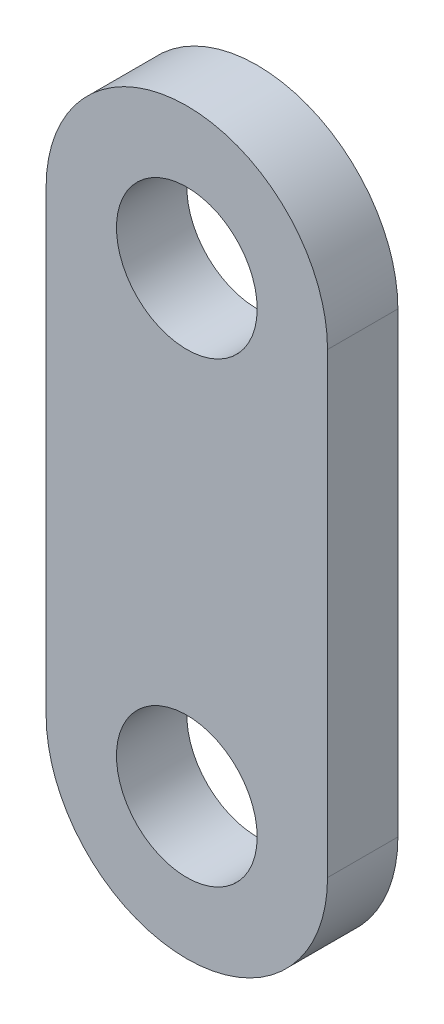
ISO-10303-21;
HEADER;
FILE_DESCRIPTION(('STEP AP214'),'2;1');
FILE_NAME('part.step','',(''),(''),'','','');
FILE_SCHEMA(('AUTOMOTIVE_DESIGN { 1 0 10303 214 1 1 1 1 }'));
ENDSEC;
DATA;
#1=APPLICATION_CONTEXT('core data for automotive mechanical design processes');
#2=APPLICATION_PROTOCOL_DEFINITION('international standard','automotive_design',2000,#1);
#3=PRODUCT_CONTEXT('',#1,'mechanical');
#4=PRODUCT('Part','Part','',(#3));
#5=PRODUCT_RELATED_PRODUCT_CATEGORY('part','',(#4));
#6=PRODUCT_DEFINITION_FORMATION('','',#4);
#7=PRODUCT_DEFINITION_CONTEXT('part definition',#1,'design');
#8=PRODUCT_DEFINITION('design','',#6,#7);
#9=PRODUCT_DEFINITION_SHAPE('','',#8);
#10=(LENGTH_UNIT() NAMED_UNIT(*) SI_UNIT(.MILLI.,.METRE.));
#11=(NAMED_UNIT(*) PLANE_ANGLE_UNIT() SI_UNIT($,.RADIAN.));
#12=(NAMED_UNIT(*) SI_UNIT($,.STERADIAN.) SOLID_ANGLE_UNIT());
#13=UNCERTAINTY_MEASURE_WITH_UNIT(LENGTH_MEASURE(1.E-05),#10,'distance_accuracy_value','');
#14=(GEOMETRIC_REPRESENTATION_CONTEXT(3) GLOBAL_UNCERTAINTY_ASSIGNED_CONTEXT((#13)) GLOBAL_UNIT_ASSIGNED_CONTEXT((#10,
#11,#12)) REPRESENTATION_CONTEXT('',''));
#15=CARTESIAN_POINT('',(0.,0.,0.));
#16=DIRECTION('',(0.,0.,1.));
#17=DIRECTION('',(1.,0.,0.));
#18=AXIS2_PLACEMENT_3D('',#15,#16,#17);
#19=CARTESIAN_POINT('',(0.,10.31875,3.175));
#20=DIRECTION('',(0.,0.,-1.));
#21=DIRECTION('',(-1.,0.,0.));
#22=AXIS2_PLACEMENT_3D('',#19,#20,#21);
#23=CYLINDRICAL_SURFACE('',#22,6.35);
#24=CARTESIAN_POINT('',(0.,10.31875,0.));
#25=DIRECTION('',(0.,0.,1.));
#26=DIRECTION('',(1.,0.,0.));
#27=AXIS2_PLACEMENT_3D('',#24,#25,#26);
#28=CIRCLE('',#27,6.35);
#29=CARTESIAN_POINT('',(6.34999999999999,10.31875,0.));
#30=VERTEX_POINT('',#29);
#31=CARTESIAN_POINT('',(-6.35,10.31875,0.));
#32=VERTEX_POINT('',#31);
#33=EDGE_CURVE('E97',#30,#32,#28,.T.);
#34=ORIENTED_EDGE('',*,*,#33,.T.);
#35=DIRECTION('',(0.,0.,-1.));
#36=VECTOR('',#35,1.);
#37=CARTESIAN_POINT('',(-6.35,10.31875,3.175));
#38=LINE('',#37,#36);
#39=CARTESIAN_POINT('',(-6.35,10.31875,3.175));
#40=VERTEX_POINT('',#39);
#41=EDGE_CURVE('E11',#40,#32,#38,.T.);
#42=ORIENTED_EDGE('',*,*,#41,.F.);
#43=CARTESIAN_POINT('',(0.,10.31875,3.175));
#44=DIRECTION('',(0.,0.,1.));
#45=DIRECTION('',(1.,0.,0.));
#46=AXIS2_PLACEMENT_3D('',#43,#44,#45);
#47=CIRCLE('',#46,6.35);
#48=CARTESIAN_POINT('',(6.34999999999999,10.31875,3.175));
#49=VERTEX_POINT('',#48);
#50=EDGE_CURVE('E85',#49,#40,#47,.T.);
#51=ORIENTED_EDGE('',*,*,#50,.F.);
#52=DIRECTION('',(0.,0.,-1.));
#53=VECTOR('',#52,1.);
#54=CARTESIAN_POINT('',(6.34999999999999,10.31875,3.175));
#55=LINE('',#54,#53);
#56=EDGE_CURVE('E93',#49,#30,#55,.T.);
#57=ORIENTED_EDGE('',*,*,#56,.T.);
#58=EDGE_LOOP('',(#34,#42,#51,#57));
#59=FACE_BOUND('',#58,.T.);
#60=ADVANCED_FACE('F34',(#59),#23,.T.);
#61=CARTESIAN_POINT('',(-6.35,10.31875,3.175));
#62=DIRECTION('',(1.,0.,0.));
#63=DIRECTION('',(0.,1.,0.));
#64=AXIS2_PLACEMENT_3D('',#61,#62,#63);
#65=PLANE('',#64);
#66=DIRECTION('',(0.,-1.,0.));
#67=VECTOR('',#66,1.);
#68=CARTESIAN_POINT('',(-6.35,10.31875,0.));
#69=LINE('',#68,#67);
#70=CARTESIAN_POINT('',(-6.34999999999999,-10.31875,0.));
#71=VERTEX_POINT('',#70);
#72=EDGE_CURVE('E89',#32,#71,#69,.T.);
#73=ORIENTED_EDGE('',*,*,#72,.T.);
#74=DIRECTION('',(0.,0.,-1.));
#75=VECTOR('',#74,1.);
#76=CARTESIAN_POINT('',(-6.34999999999999,-10.31875,3.175));
#77=LINE('',#76,#75);
#78=CARTESIAN_POINT('',(-6.34999999999999,-10.31875,3.175));
#79=VERTEX_POINT('',#78);
#80=EDGE_CURVE('E42',#79,#71,#77,.T.);
#81=ORIENTED_EDGE('',*,*,#80,.F.);
#82=DIRECTION('',(0.,-1.,0.));
#83=VECTOR('',#82,1.);
#84=CARTESIAN_POINT('',(-6.35,10.31875,3.175));
#85=LINE('',#84,#83);
#86=EDGE_CURVE('E80',#40,#79,#85,.T.);
#87=ORIENTED_EDGE('',*,*,#86,.F.);
#88=ORIENTED_EDGE('',*,*,#41,.T.);
#89=EDGE_LOOP('',(#73,#81,#87,#88));
#90=FACE_BOUND('',#89,.T.);
#91=ADVANCED_FACE('F88',(#90),#65,.F.);
#92=CARTESIAN_POINT('',(0.,-10.31875,3.175));
#93=DIRECTION('',(0.,0.,-1.));
#94=DIRECTION('',(-1.,0.,0.));
#95=AXIS2_PLACEMENT_3D('',#92,#93,#94);
#96=CYLINDRICAL_SURFACE('',#95,6.35);
#97=CARTESIAN_POINT('',(0.,-10.31875,0.));
#98=DIRECTION('',(0.,0.,1.));
#99=DIRECTION('',(1.,0.,0.));
#100=AXIS2_PLACEMENT_3D('',#97,#98,#99);
#101=CIRCLE('',#100,6.35);
#102=CARTESIAN_POINT('',(6.35,-10.31875,0.));
#103=VERTEX_POINT('',#102);
#104=EDGE_CURVE('E67',#71,#103,#101,.T.);
#105=ORIENTED_EDGE('',*,*,#104,.T.);
#106=DIRECTION('',(0.,0.,-1.));
#107=VECTOR('',#106,1.);
#108=CARTESIAN_POINT('',(6.35,-10.31875,3.175));
#109=LINE('',#108,#107);
#110=CARTESIAN_POINT('',(6.35,-10.31875,3.175));
#111=VERTEX_POINT('',#110);
#112=EDGE_CURVE('E90',#111,#103,#109,.T.);
#113=ORIENTED_EDGE('',*,*,#112,.F.);
#114=CARTESIAN_POINT('',(0.,-10.31875,3.175));
#115=DIRECTION('',(0.,0.,1.));
#116=DIRECTION('',(1.,0.,0.));
#117=AXIS2_PLACEMENT_3D('',#114,#115,#116);
#118=CIRCLE('',#117,6.35);
#119=EDGE_CURVE('E83',#79,#111,#118,.T.);
#120=ORIENTED_EDGE('',*,*,#119,.F.);
#121=ORIENTED_EDGE('',*,*,#80,.T.);
#122=EDGE_LOOP('',(#105,#113,#120,#121));
#123=FACE_BOUND('',#122,.T.);
#124=ADVANCED_FACE('F91',(#123),#96,.T.);
#125=CARTESIAN_POINT('',(6.34999999999999,10.31875,3.175));
#126=DIRECTION('',(-1.,0.,0.));
#127=DIRECTION('',(0.,-1.,0.));
#128=AXIS2_PLACEMENT_3D('',#125,#126,#127);
#129=PLANE('',#128);
#130=DIRECTION('',(0.,1.,0.));
#131=VECTOR('',#130,1.);
#132=CARTESIAN_POINT('',(6.34999999999999,10.31875,0.));
#133=LINE('',#132,#131);
#134=EDGE_CURVE('E73',#103,#30,#133,.T.);
#135=ORIENTED_EDGE('',*,*,#134,.T.);
#136=ORIENTED_EDGE('',*,*,#56,.F.);
#137=DIRECTION('',(0.,1.,0.));
#138=VECTOR('',#137,1.);
#139=CARTESIAN_POINT('',(6.34999999999999,10.31875,3.175));
#140=LINE('',#139,#138);
#141=EDGE_CURVE('E50',#111,#49,#140,.T.);
#142=ORIENTED_EDGE('',*,*,#141,.F.);
#143=ORIENTED_EDGE('',*,*,#112,.T.);
#144=EDGE_LOOP('',(#135,#136,#142,#143));
#145=FACE_BOUND('',#144,.T.);
#146=ADVANCED_FACE('F105',(#145),#129,.F.);
#147=CARTESIAN_POINT('',(0.,10.31875,3.175));
#148=DIRECTION('',(0.,0.,1.));
#149=DIRECTION('',(1.,0.,0.));
#150=AXIS2_PLACEMENT_3D('',#147,#148,#149);
#151=PLANE('',#150);
#152=CARTESIAN_POINT('',(0.,10.31875,3.175));
#153=DIRECTION('',(0.,0.,1.));
#154=DIRECTION('',(1.,0.,0.));
#155=AXIS2_PLACEMENT_3D('',#152,#153,#154);
#156=CIRCLE('',#155,3.175);
#157=CARTESIAN_POINT('',(3.17500000000001,10.31875,3.175));
#158=VERTEX_POINT('',#157);
#159=EDGE_CURVE('E117',#158,#158,#156,.T.);
#160=ORIENTED_EDGE('',*,*,#159,.F.);
#161=EDGE_LOOP('',(#160));
#162=FACE_BOUND('',#161,.T.);
#163=CARTESIAN_POINT('',(0.,-10.31875,3.175));
#164=DIRECTION('',(0.,0.,1.));
#165=DIRECTION('',(1.,0.,0.));
#166=AXIS2_PLACEMENT_3D('',#163,#164,#165);
#167=CIRCLE('',#166,3.175);
#168=CARTESIAN_POINT('',(3.175,-10.31875,3.175));
#169=VERTEX_POINT('',#168);
#170=EDGE_CURVE('E111',#169,#169,#167,.T.);
#171=ORIENTED_EDGE('',*,*,#170,.F.);
#172=EDGE_LOOP('',(#171));
#173=FACE_BOUND('',#172,.T.);
#174=ORIENTED_EDGE('',*,*,#50,.T.);
#175=ORIENTED_EDGE('',*,*,#86,.T.);
#176=ORIENTED_EDGE('',*,*,#119,.T.);
#177=ORIENTED_EDGE('',*,*,#141,.T.);
#178=EDGE_LOOP('',(#174,#175,#176,#177));
#179=FACE_BOUND('',#178,.T.);
#180=ADVANCED_FACE('F81',(#162,#173,#179),#151,.T.);
#181=CARTESIAN_POINT('',(0.,10.31875,0.));
#182=DIRECTION('',(0.,0.,1.));
#183=DIRECTION('',(1.,0.,0.));
#184=AXIS2_PLACEMENT_3D('',#181,#182,#183);
#185=PLANE('',#184);
#186=CARTESIAN_POINT('',(0.,10.31875,0.));
#187=DIRECTION('',(0.,0.,1.));
#188=DIRECTION('',(1.,0.,0.));
#189=AXIS2_PLACEMENT_3D('',#186,#187,#188);
#190=CIRCLE('',#189,3.175);
#191=CARTESIAN_POINT('',(3.17500000000001,10.31875,0.));
#192=VERTEX_POINT('',#191);
#193=EDGE_CURVE('E100',#192,#192,#190,.T.);
#194=ORIENTED_EDGE('',*,*,#193,.T.);
#195=EDGE_LOOP('',(#194));
#196=FACE_BOUND('',#195,.T.);
#197=CARTESIAN_POINT('',(0.,-10.31875,0.));
#198=DIRECTION('',(0.,0.,1.));
#199=DIRECTION('',(1.,0.,0.));
#200=AXIS2_PLACEMENT_3D('',#197,#198,#199);
#201=CIRCLE('',#200,3.175);
#202=CARTESIAN_POINT('',(3.175,-10.31875,0.));
#203=VERTEX_POINT('',#202);
#204=EDGE_CURVE('E114',#203,#203,#201,.T.);
#205=ORIENTED_EDGE('',*,*,#204,.T.);
#206=EDGE_LOOP('',(#205));
#207=FACE_BOUND('',#206,.T.);
#208=ORIENTED_EDGE('',*,*,#33,.F.);
#209=ORIENTED_EDGE('',*,*,#134,.F.);
#210=ORIENTED_EDGE('',*,*,#104,.F.);
#211=ORIENTED_EDGE('',*,*,#72,.F.);
#212=EDGE_LOOP('',(#208,#209,#210,#211));
#213=FACE_BOUND('',#212,.T.);
#214=ADVANCED_FACE('F108',(#196,#207,#213),#185,.F.);
#215=CARTESIAN_POINT('',(0.,-10.31875,0.));
#216=DIRECTION('',(0.,0.,1.));
#217=DIRECTION('',(1.,0.,0.));
#218=AXIS2_PLACEMENT_3D('',#215,#216,#217);
#219=CYLINDRICAL_SURFACE('',#218,3.175);
#220=ORIENTED_EDGE('',*,*,#204,.F.);
#221=EDGE_LOOP('',(#220));
#222=FACE_BOUND('',#221,.T.);
#223=ORIENTED_EDGE('',*,*,#170,.T.);
#224=EDGE_LOOP('',(#223));
#225=FACE_BOUND('',#224,.T.);
#226=ADVANCED_FACE('F128',(#222,#225),#219,.F.);
#227=CARTESIAN_POINT('',(0.,10.31875,0.));
#228=DIRECTION('',(0.,0.,1.));
#229=DIRECTION('',(1.,0.,0.));
#230=AXIS2_PLACEMENT_3D('',#227,#228,#229);
#231=CYLINDRICAL_SURFACE('',#230,3.175);
#232=ORIENTED_EDGE('',*,*,#193,.F.);
#233=EDGE_LOOP('',(#232));
#234=FACE_BOUND('',#233,.T.);
#235=ORIENTED_EDGE('',*,*,#159,.T.);
#236=EDGE_LOOP('',(#235));
#237=FACE_BOUND('',#236,.T.);
#238=ADVANCED_FACE('F125',(#234,#237),#231,.F.);
#239=CLOSED_SHELL('',(#60,#91,#124,#146,#180,#214,#226,#238));
#240=MANIFOLD_SOLID_BREP('B2',#239);
#241=ADVANCED_BREP_SHAPE_REPRESENTATION('',(#18,#240),#14);
#242=SHAPE_DEFINITION_REPRESENTATION(#9,#241);
ENDSEC;
END-ISO-10303-21;
